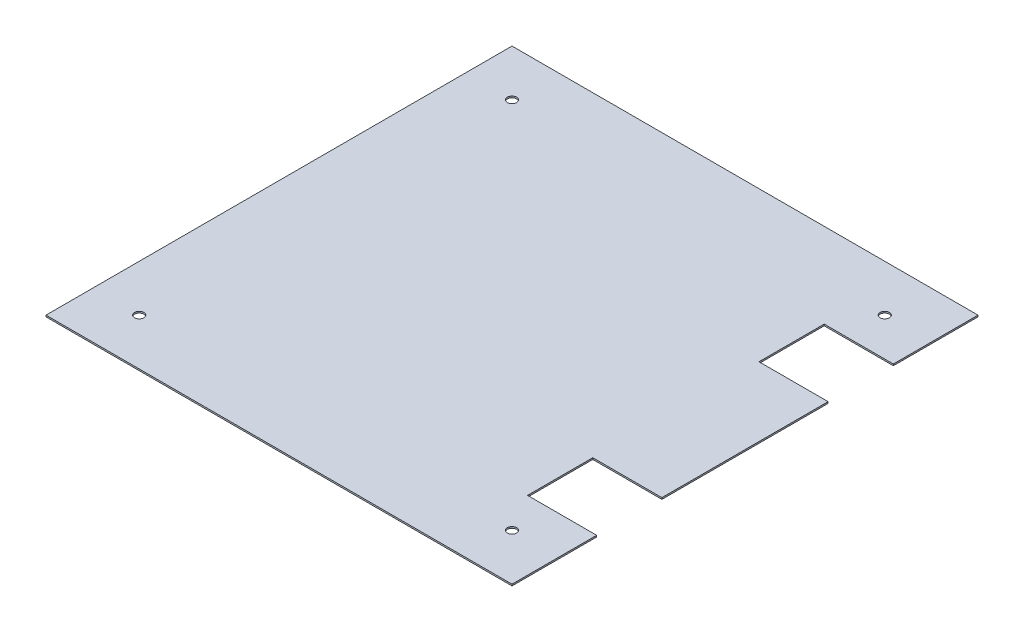
ISO-10303-21;
HEADER;
FILE_DESCRIPTION(('STEP AP214'),'2;1');
FILE_NAME('part.step','',(''),(''),'','','');
FILE_SCHEMA(('AUTOMOTIVE_DESIGN { 1 0 10303 214 1 1 1 1 }'));
ENDSEC;
DATA;
#1=APPLICATION_CONTEXT('core data for automotive mechanical design processes');
#2=APPLICATION_PROTOCOL_DEFINITION('international standard','automotive_design',2000,#1);
#3=PRODUCT_CONTEXT('',#1,'mechanical');
#4=PRODUCT('Part','Part','',(#3));
#5=PRODUCT_RELATED_PRODUCT_CATEGORY('part','',(#4));
#6=PRODUCT_DEFINITION_FORMATION('','',#4);
#7=PRODUCT_DEFINITION_CONTEXT('part definition',#1,'design');
#8=PRODUCT_DEFINITION('design','',#6,#7);
#9=PRODUCT_DEFINITION_SHAPE('','',#8);
#10=(LENGTH_UNIT() NAMED_UNIT(*) SI_UNIT(.MILLI.,.METRE.));
#11=(NAMED_UNIT(*) PLANE_ANGLE_UNIT() SI_UNIT($,.RADIAN.));
#12=(NAMED_UNIT(*) SI_UNIT($,.STERADIAN.) SOLID_ANGLE_UNIT());
#13=UNCERTAINTY_MEASURE_WITH_UNIT(LENGTH_MEASURE(1.E-05),#10,'distance_accuracy_value','');
#14=(GEOMETRIC_REPRESENTATION_CONTEXT(3) GLOBAL_UNCERTAINTY_ASSIGNED_CONTEXT((#13)) GLOBAL_UNIT_ASSIGNED_CONTEXT((#10,
#11,#12)) REPRESENTATION_CONTEXT('',''));
#15=CARTESIAN_POINT('',(0.,0.,0.));
#16=DIRECTION('',(0.,0.,1.));
#17=DIRECTION('',(1.,0.,0.));
#18=AXIS2_PLACEMENT_3D('',#15,#16,#17);
#19=CARTESIAN_POINT('',(0.,1.,0.));
#20=DIRECTION('',(0.,1.,0.));
#21=DIRECTION('',(0.,0.,1.));
#22=AXIS2_PLACEMENT_3D('',#19,#20,#21);
#23=PLANE('',#22);
#24=CARTESIAN_POINT('',(213.243141408516,1.,253.714524623906));
#25=DIRECTION('',(0.,1.,0.));
#26=DIRECTION('',(0.,0.,1.));
#27=AXIS2_PLACEMENT_3D('',#24,#25,#26);
#28=CIRCLE('',#27,2.99999999999999);
#29=CARTESIAN_POINT('',(213.243141408516,1.,256.714524623906));
#30=VERTEX_POINT('',#29);
#31=EDGE_CURVE('E189',#30,#30,#28,.T.);
#32=ORIENTED_EDGE('',*,*,#31,.F.);
#33=EDGE_LOOP('',(#32));
#34=FACE_BOUND('',#33,.T.);
#35=CARTESIAN_POINT('',(-26.7568585914842,1.,13.7145246239061));
#36=DIRECTION('',(0.,1.,0.));
#37=DIRECTION('',(0.,0.,1.));
#38=AXIS2_PLACEMENT_3D('',#35,#36,#37);
#39=CIRCLE('',#38,3.);
#40=CARTESIAN_POINT('',(-26.7568585914842,1.,16.7145246239061));
#41=VERTEX_POINT('',#40);
#42=EDGE_CURVE('E201',#41,#41,#39,.T.);
#43=ORIENTED_EDGE('',*,*,#42,.F.);
#44=EDGE_LOOP('',(#43));
#45=FACE_BOUND('',#44,.T.);
#46=CARTESIAN_POINT('',(213.243141408516,1.,13.7145246239061));
#47=DIRECTION('',(0.,1.,0.));
#48=DIRECTION('',(0.,0.,1.));
#49=AXIS2_PLACEMENT_3D('',#46,#47,#48);
#50=CIRCLE('',#49,2.99999999999999);
#51=CARTESIAN_POINT('',(213.243141408516,1.,16.7145246239061));
#52=VERTEX_POINT('',#51);
#53=EDGE_CURVE('E195',#52,#52,#50,.T.);
#54=ORIENTED_EDGE('',*,*,#53,.F.);
#55=EDGE_LOOP('',(#54));
#56=FACE_BOUND('',#55,.T.);
#57=CARTESIAN_POINT('',(-26.7568585914842,1.,253.714524623906));
#58=DIRECTION('',(0.,1.,0.));
#59=DIRECTION('',(0.,0.,1.));
#60=AXIS2_PLACEMENT_3D('',#57,#58,#59);
#61=CIRCLE('',#60,3.);
#62=CARTESIAN_POINT('',(-26.7568585914842,1.,256.714524623906));
#63=VERTEX_POINT('',#62);
#64=EDGE_CURVE('E183',#63,#63,#61,.T.);
#65=ORIENTED_EDGE('',*,*,#64,.F.);
#66=EDGE_LOOP('',(#65));
#67=FACE_BOUND('',#66,.T.);
#68=DIRECTION('',(0.,0.,-1.));
#69=VECTOR('',#68,1.);
#70=CARTESIAN_POINT('',(243.243141408516,1.,-16.2854753760939));
#71=LINE('',#70,#69);
#72=CARTESIAN_POINT('',(243.243141408516,1.,187.214524623906));
#73=VERTEX_POINT('',#72);
#74=CARTESIAN_POINT('',(243.243141408516,1.,80.2145246239061));
#75=VERTEX_POINT('',#74);
#76=EDGE_CURVE('E148',#73,#75,#71,.T.);
#77=ORIENTED_EDGE('',*,*,#76,.T.);
#78=DIRECTION('',(1.,0.,0.));
#79=VECTOR('',#78,1.);
#80=CARTESIAN_POINT('',(198.743141408516,1.,80.2145246239061));
#81=LINE('',#80,#79);
#82=CARTESIAN_POINT('',(198.743141408516,1.,80.2145246239061));
#83=VERTEX_POINT('',#82);
#84=EDGE_CURVE('E135',#83,#75,#81,.T.);
#85=ORIENTED_EDGE('',*,*,#84,.F.);
#86=DIRECTION('',(0.,0.,1.));
#87=VECTOR('',#86,1.);
#88=CARTESIAN_POINT('',(198.743141408516,1.,38.2145246239061));
#89=LINE('',#88,#87);
#90=CARTESIAN_POINT('',(198.743141408516,1.,38.2145246239061));
#91=VERTEX_POINT('',#90);
#92=EDGE_CURVE('E125',#91,#83,#89,.T.);
#93=ORIENTED_EDGE('',*,*,#92,.F.);
#94=DIRECTION('',(-1.,0.,0.));
#95=VECTOR('',#94,1.);
#96=CARTESIAN_POINT('',(198.743141408516,1.,38.2145246239061));
#97=LINE('',#96,#95);
#98=CARTESIAN_POINT('',(243.243141408516,1.,38.2145246239061));
#99=VERTEX_POINT('',#98);
#100=EDGE_CURVE('E149',#99,#91,#97,.T.);
#101=ORIENTED_EDGE('',*,*,#100,.F.);
#102=CARTESIAN_POINT('',(243.243141408516,1.,-16.2854753760939));
#103=VERTEX_POINT('',#102);
#104=EDGE_CURVE('E213',#99,#103,#71,.T.);
#105=ORIENTED_EDGE('',*,*,#104,.T.);
#106=DIRECTION('',(-1.,0.,0.));
#107=VECTOR('',#106,1.);
#108=CARTESIAN_POINT('',(-56.7568585914842,1.,-16.2854753760939));
#109=LINE('',#108,#107);
#110=CARTESIAN_POINT('',(-56.7568585914842,1.,-16.2854753760939));
#111=VERTEX_POINT('',#110);
#112=EDGE_CURVE('E217',#103,#111,#109,.T.);
#113=ORIENTED_EDGE('',*,*,#112,.T.);
#114=DIRECTION('',(0.,0.,1.));
#115=VECTOR('',#114,1.);
#116=CARTESIAN_POINT('',(-56.7568585914842,1.,-16.2854753760939));
#117=LINE('',#116,#115);
#118=CARTESIAN_POINT('',(-56.7568585914841,1.,283.714524623906));
#119=VERTEX_POINT('',#118);
#120=EDGE_CURVE('E207',#111,#119,#117,.T.);
#121=ORIENTED_EDGE('',*,*,#120,.T.);
#122=DIRECTION('',(1.,0.,0.));
#123=VECTOR('',#122,1.);
#124=CARTESIAN_POINT('',(-56.7568585914841,1.,283.714524623906));
#125=LINE('',#124,#123);
#126=CARTESIAN_POINT('',(243.243141408516,1.,283.714524623906));
#127=VERTEX_POINT('',#126);
#128=EDGE_CURVE('E210',#119,#127,#125,.T.);
#129=ORIENTED_EDGE('',*,*,#128,.T.);
#130=CARTESIAN_POINT('',(243.243141408516,1.,229.214524623906));
#131=VERTEX_POINT('',#130);
#132=EDGE_CURVE('E214',#127,#131,#71,.T.);
#133=ORIENTED_EDGE('',*,*,#132,.T.);
#134=DIRECTION('',(1.,0.,0.));
#135=VECTOR('',#134,1.);
#136=CARTESIAN_POINT('',(198.743141408516,1.,229.214524623906));
#137=LINE('',#136,#135);
#138=CARTESIAN_POINT('',(198.743141408516,1.,229.214524623906));
#139=VERTEX_POINT('',#138);
#140=EDGE_CURVE('E163',#139,#131,#137,.T.);
#141=ORIENTED_EDGE('',*,*,#140,.F.);
#142=DIRECTION('',(0.,0.,1.));
#143=VECTOR('',#142,1.);
#144=CARTESIAN_POINT('',(198.743141408516,1.,187.214524623906));
#145=LINE('',#144,#143);
#146=CARTESIAN_POINT('',(198.743141408516,1.,187.214524623906));
#147=VERTEX_POINT('',#146);
#148=EDGE_CURVE('E161',#147,#139,#145,.T.);
#149=ORIENTED_EDGE('',*,*,#148,.F.);
#150=DIRECTION('',(-1.,0.,0.));
#151=VECTOR('',#150,1.);
#152=CARTESIAN_POINT('',(198.743141408516,1.,187.214524623906));
#153=LINE('',#152,#151);
#154=EDGE_CURVE('E165',#73,#147,#153,.T.);
#155=ORIENTED_EDGE('',*,*,#154,.F.);
#156=EDGE_LOOP('',(#77,#85,#93,#101,#105,#113,#121,#129,#133,#141,#149,#155));
#157=FACE_BOUND('',#156,.T.);
#158=ADVANCED_FACE('F35',(#34,#45,#56,#67,#157),#23,.T.);
#159=CARTESIAN_POINT('',(0.,0.,0.));
#160=DIRECTION('',(0.,1.,0.));
#161=DIRECTION('',(0.,0.,1.));
#162=AXIS2_PLACEMENT_3D('',#159,#160,#161);
#163=PLANE('',#162);
#164=CARTESIAN_POINT('',(213.243141408516,0.,253.714524623906));
#165=DIRECTION('',(0.,1.,0.));
#166=DIRECTION('',(0.,0.,1.));
#167=AXIS2_PLACEMENT_3D('',#164,#165,#166);
#168=CIRCLE('',#167,2.99999999999999);
#169=CARTESIAN_POINT('',(213.243141408516,0.,256.714524623906));
#170=VERTEX_POINT('',#169);
#171=EDGE_CURVE('E186',#170,#170,#168,.T.);
#172=ORIENTED_EDGE('',*,*,#171,.T.);
#173=EDGE_LOOP('',(#172));
#174=FACE_BOUND('',#173,.T.);
#175=CARTESIAN_POINT('',(-26.7568585914842,0.,13.7145246239061));
#176=DIRECTION('',(0.,1.,0.));
#177=DIRECTION('',(0.,0.,1.));
#178=AXIS2_PLACEMENT_3D('',#175,#176,#177);
#179=CIRCLE('',#178,3.);
#180=CARTESIAN_POINT('',(-26.7568585914842,0.,16.7145246239061));
#181=VERTEX_POINT('',#180);
#182=EDGE_CURVE('E198',#181,#181,#179,.T.);
#183=ORIENTED_EDGE('',*,*,#182,.T.);
#184=EDGE_LOOP('',(#183));
#185=FACE_BOUND('',#184,.T.);
#186=CARTESIAN_POINT('',(213.243141408516,0.,13.7145246239061));
#187=DIRECTION('',(0.,1.,0.));
#188=DIRECTION('',(0.,0.,1.));
#189=AXIS2_PLACEMENT_3D('',#186,#187,#188);
#190=CIRCLE('',#189,2.99999999999999);
#191=CARTESIAN_POINT('',(213.243141408516,0.,16.7145246239061));
#192=VERTEX_POINT('',#191);
#193=EDGE_CURVE('E192',#192,#192,#190,.T.);
#194=ORIENTED_EDGE('',*,*,#193,.T.);
#195=EDGE_LOOP('',(#194));
#196=FACE_BOUND('',#195,.T.);
#197=CARTESIAN_POINT('',(-26.7568585914842,0.,253.714524623906));
#198=DIRECTION('',(0.,1.,0.));
#199=DIRECTION('',(0.,0.,1.));
#200=AXIS2_PLACEMENT_3D('',#197,#198,#199);
#201=CIRCLE('',#200,3.);
#202=CARTESIAN_POINT('',(-26.7568585914842,0.,256.714524623906));
#203=VERTEX_POINT('',#202);
#204=EDGE_CURVE('E182',#203,#203,#201,.T.);
#205=ORIENTED_EDGE('',*,*,#204,.T.);
#206=EDGE_LOOP('',(#205));
#207=FACE_BOUND('',#206,.T.);
#208=DIRECTION('',(1.,0.,0.));
#209=VECTOR('',#208,1.);
#210=CARTESIAN_POINT('',(198.743141408516,0.,80.2145246239061));
#211=LINE('',#210,#209);
#212=CARTESIAN_POINT('',(198.743141408516,0.,80.2145246239061));
#213=VERTEX_POINT('',#212);
#214=CARTESIAN_POINT('',(243.243141408516,0.,80.2145246239061));
#215=VERTEX_POINT('',#214);
#216=EDGE_CURVE('E141',#213,#215,#211,.T.);
#217=ORIENTED_EDGE('',*,*,#216,.T.);
#218=DIRECTION('',(0.,0.,-1.));
#219=VECTOR('',#218,1.);
#220=CARTESIAN_POINT('',(243.243141408516,0.,-16.2854753760939));
#221=LINE('',#220,#219);
#222=CARTESIAN_POINT('',(243.243141408516,0.,187.214524623906));
#223=VERTEX_POINT('',#222);
#224=EDGE_CURVE('E228',#223,#215,#221,.T.);
#225=ORIENTED_EDGE('',*,*,#224,.F.);
#226=DIRECTION('',(-1.,0.,0.));
#227=VECTOR('',#226,1.);
#228=CARTESIAN_POINT('',(198.743141408516,0.,187.214524623906));
#229=LINE('',#228,#227);
#230=CARTESIAN_POINT('',(198.743141408516,0.,187.214524623906));
#231=VERTEX_POINT('',#230);
#232=EDGE_CURVE('E58',#223,#231,#229,.T.);
#233=ORIENTED_EDGE('',*,*,#232,.T.);
#234=DIRECTION('',(0.,0.,1.));
#235=VECTOR('',#234,1.);
#236=CARTESIAN_POINT('',(198.743141408516,0.,187.214524623906));
#237=LINE('',#236,#235);
#238=CARTESIAN_POINT('',(198.743141408516,0.,229.214524623906));
#239=VERTEX_POINT('',#238);
#240=EDGE_CURVE('E142',#231,#239,#237,.T.);
#241=ORIENTED_EDGE('',*,*,#240,.T.);
#242=DIRECTION('',(1.,0.,0.));
#243=VECTOR('',#242,1.);
#244=CARTESIAN_POINT('',(198.743141408516,0.,229.214524623906));
#245=LINE('',#244,#243);
#246=CARTESIAN_POINT('',(243.243141408516,0.,229.214524623906));
#247=VERTEX_POINT('',#246);
#248=EDGE_CURVE('E170',#239,#247,#245,.T.);
#249=ORIENTED_EDGE('',*,*,#248,.T.);
#250=CARTESIAN_POINT('',(243.243141408516,0.,283.714524623906));
#251=VERTEX_POINT('',#250);
#252=EDGE_CURVE('E225',#251,#247,#221,.T.);
#253=ORIENTED_EDGE('',*,*,#252,.F.);
#254=DIRECTION('',(1.,0.,0.));
#255=VECTOR('',#254,1.);
#256=CARTESIAN_POINT('',(-56.7568585914841,0.,283.714524623906));
#257=LINE('',#256,#255);
#258=CARTESIAN_POINT('',(-56.7568585914841,0.,283.714524623906));
#259=VERTEX_POINT('',#258);
#260=EDGE_CURVE('E222',#259,#251,#257,.T.);
#261=ORIENTED_EDGE('',*,*,#260,.F.);
#262=DIRECTION('',(0.,0.,1.));
#263=VECTOR('',#262,1.);
#264=CARTESIAN_POINT('',(-56.7568585914842,0.,-16.2854753760939));
#265=LINE('',#264,#263);
#266=CARTESIAN_POINT('',(-56.7568585914842,0.,-16.2854753760939));
#267=VERTEX_POINT('',#266);
#268=EDGE_CURVE('E204',#267,#259,#265,.T.);
#269=ORIENTED_EDGE('',*,*,#268,.F.);
#270=DIRECTION('',(-1.,0.,0.));
#271=VECTOR('',#270,1.);
#272=CARTESIAN_POINT('',(-56.7568585914842,0.,-16.2854753760939));
#273=LINE('',#272,#271);
#274=CARTESIAN_POINT('',(243.243141408516,0.,-16.2854753760939));
#275=VERTEX_POINT('',#274);
#276=EDGE_CURVE('E211',#275,#267,#273,.T.);
#277=ORIENTED_EDGE('',*,*,#276,.F.);
#278=CARTESIAN_POINT('',(243.243141408516,0.,38.2145246239061));
#279=VERTEX_POINT('',#278);
#280=EDGE_CURVE('E224',#279,#275,#221,.T.);
#281=ORIENTED_EDGE('',*,*,#280,.F.);
#282=DIRECTION('',(-1.,0.,0.));
#283=VECTOR('',#282,1.);
#284=CARTESIAN_POINT('',(198.743141408516,0.,38.2145246239061));
#285=LINE('',#284,#283);
#286=CARTESIAN_POINT('',(198.743141408516,0.,38.2145246239061));
#287=VERTEX_POINT('',#286);
#288=EDGE_CURVE('E50',#279,#287,#285,.T.);
#289=ORIENTED_EDGE('',*,*,#288,.T.);
#290=DIRECTION('',(0.,0.,1.));
#291=VECTOR('',#290,1.);
#292=CARTESIAN_POINT('',(198.743141408516,0.,38.2145246239061));
#293=LINE('',#292,#291);
#294=EDGE_CURVE('E153',#287,#213,#293,.T.);
#295=ORIENTED_EDGE('',*,*,#294,.T.);
#296=EDGE_LOOP('',(#217,#225,#233,#241,#249,#253,#261,#269,#277,#281,#289,#295));
#297=FACE_BOUND('',#296,.T.);
#298=ADVANCED_FACE('F243',(#174,#185,#196,#207,#297),#163,.F.);
#299=CARTESIAN_POINT('',(243.243141408516,1.,-16.2854753760939));
#300=DIRECTION('',(-1.,0.,0.));
#301=DIRECTION('',(0.,0.,1.));
#302=AXIS2_PLACEMENT_3D('',#299,#300,#301);
#303=PLANE('',#302);
#304=DIRECTION('',(0.,-1.,0.));
#305=VECTOR('',#304,1.);
#306=CARTESIAN_POINT('',(243.243141408516,1.,80.2145246239061));
#307=LINE('',#306,#305);
#308=EDGE_CURVE('E143',#75,#215,#307,.T.);
#309=ORIENTED_EDGE('',*,*,#308,.F.);
#310=ORIENTED_EDGE('',*,*,#76,.F.);
#311=DIRECTION('',(0.,-1.,0.));
#312=VECTOR('',#311,1.);
#313=CARTESIAN_POINT('',(243.243141408516,1.,187.214524623906));
#314=LINE('',#313,#312);
#315=EDGE_CURVE('E175',#73,#223,#314,.T.);
#316=ORIENTED_EDGE('',*,*,#315,.T.);
#317=ORIENTED_EDGE('',*,*,#224,.T.);
#318=EDGE_LOOP('',(#309,#310,#316,#317));
#319=FACE_BOUND('',#318,.T.);
#320=ADVANCED_FACE('F271',(#319),#303,.F.);
#321=DIRECTION('',(0.,-1.,0.));
#322=VECTOR('',#321,1.);
#323=CARTESIAN_POINT('',(243.243141408516,1.,38.2145246239061));
#324=LINE('',#323,#322);
#325=EDGE_CURVE('E158',#99,#279,#324,.T.);
#326=ORIENTED_EDGE('',*,*,#325,.T.);
#327=ORIENTED_EDGE('',*,*,#280,.T.);
#328=DIRECTION('',(0.,-1.,0.));
#329=VECTOR('',#328,1.);
#330=CARTESIAN_POINT('',(243.243141408516,1.,-16.2854753760939));
#331=LINE('',#330,#329);
#332=EDGE_CURVE('E232',#103,#275,#331,.T.);
#333=ORIENTED_EDGE('',*,*,#332,.F.);
#334=ORIENTED_EDGE('',*,*,#104,.F.);
#335=EDGE_LOOP('',(#326,#327,#333,#334));
#336=FACE_BOUND('',#335,.T.);
#337=ADVANCED_FACE('F267',(#336),#303,.F.);
#338=DIRECTION('',(0.,-1.,0.));
#339=VECTOR('',#338,1.);
#340=CARTESIAN_POINT('',(243.243141408516,1.,229.214524623906));
#341=LINE('',#340,#339);
#342=EDGE_CURVE('E177',#131,#247,#341,.T.);
#343=ORIENTED_EDGE('',*,*,#342,.F.);
#344=ORIENTED_EDGE('',*,*,#132,.F.);
#345=DIRECTION('',(0.,-1.,0.));
#346=VECTOR('',#345,1.);
#347=CARTESIAN_POINT('',(243.243141408516,1.,283.714524623906));
#348=LINE('',#347,#346);
#349=EDGE_CURVE('E43',#127,#251,#348,.T.);
#350=ORIENTED_EDGE('',*,*,#349,.T.);
#351=ORIENTED_EDGE('',*,*,#252,.T.);
#352=EDGE_LOOP('',(#343,#344,#350,#351));
#353=FACE_BOUND('',#352,.T.);
#354=ADVANCED_FACE('F240',(#353),#303,.F.);
#355=CARTESIAN_POINT('',(-56.7568585914842,1.,-16.2854753760939));
#356=DIRECTION('',(1.,0.,0.));
#357=DIRECTION('',(0.,0.,-1.));
#358=AXIS2_PLACEMENT_3D('',#355,#356,#357);
#359=PLANE('',#358);
#360=ORIENTED_EDGE('',*,*,#268,.T.);
#361=DIRECTION('',(0.,-1.,0.));
#362=VECTOR('',#361,1.);
#363=CARTESIAN_POINT('',(-56.7568585914841,1.,283.714524623906));
#364=LINE('',#363,#362);
#365=EDGE_CURVE('E11',#119,#259,#364,.T.);
#366=ORIENTED_EDGE('',*,*,#365,.F.);
#367=ORIENTED_EDGE('',*,*,#120,.F.);
#368=DIRECTION('',(0.,-1.,0.));
#369=VECTOR('',#368,1.);
#370=CARTESIAN_POINT('',(-56.7568585914842,1.,-16.2854753760939));
#371=LINE('',#370,#369);
#372=EDGE_CURVE('E219',#111,#267,#371,.T.);
#373=ORIENTED_EDGE('',*,*,#372,.T.);
#374=EDGE_LOOP('',(#360,#366,#367,#373));
#375=FACE_BOUND('',#374,.T.);
#376=ADVANCED_FACE('F37',(#375),#359,.F.);
#377=CARTESIAN_POINT('',(-56.7568585914841,1.,283.714524623906));
#378=DIRECTION('',(0.,0.,-1.));
#379=DIRECTION('',(-1.,0.,0.));
#380=AXIS2_PLACEMENT_3D('',#377,#378,#379);
#381=PLANE('',#380);
#382=ORIENTED_EDGE('',*,*,#260,.T.);
#383=ORIENTED_EDGE('',*,*,#349,.F.);
#384=ORIENTED_EDGE('',*,*,#128,.F.);
#385=ORIENTED_EDGE('',*,*,#365,.T.);
#386=EDGE_LOOP('',(#382,#383,#384,#385));
#387=FACE_BOUND('',#386,.T.);
#388=ADVANCED_FACE('F256',(#387),#381,.F.);
#389=CARTESIAN_POINT('',(-56.7568585914842,1.,-16.2854753760939));
#390=DIRECTION('',(0.,0.,1.));
#391=DIRECTION('',(1.,0.,0.));
#392=AXIS2_PLACEMENT_3D('',#389,#390,#391);
#393=PLANE('',#392);
#394=ORIENTED_EDGE('',*,*,#276,.T.);
#395=ORIENTED_EDGE('',*,*,#372,.F.);
#396=ORIENTED_EDGE('',*,*,#112,.F.);
#397=ORIENTED_EDGE('',*,*,#332,.T.);
#398=EDGE_LOOP('',(#394,#395,#396,#397));
#399=FACE_BOUND('',#398,.T.);
#400=ADVANCED_FACE('F262',(#399),#393,.F.);
#401=CARTESIAN_POINT('',(-26.7568585914842,1.,13.7145246239061));
#402=DIRECTION('',(0.,-1.,0.));
#403=DIRECTION('',(0.,0.,-1.));
#404=AXIS2_PLACEMENT_3D('',#401,#402,#403);
#405=CYLINDRICAL_SURFACE('',#404,3.);
#406=ORIENTED_EDGE('',*,*,#42,.T.);
#407=EDGE_LOOP('',(#406));
#408=FACE_BOUND('',#407,.T.);
#409=ORIENTED_EDGE('',*,*,#182,.F.);
#410=EDGE_LOOP('',(#409));
#411=FACE_BOUND('',#410,.T.);
#412=ADVANCED_FACE('F293',(#408,#411),#405,.F.);
#413=CARTESIAN_POINT('',(213.243141408516,1.,13.7145246239061));
#414=DIRECTION('',(0.,-1.,0.));
#415=DIRECTION('',(0.,0.,-1.));
#416=AXIS2_PLACEMENT_3D('',#413,#414,#415);
#417=CYLINDRICAL_SURFACE('',#416,2.99999999999999);
#418=ORIENTED_EDGE('',*,*,#53,.T.);
#419=EDGE_LOOP('',(#418));
#420=FACE_BOUND('',#419,.T.);
#421=ORIENTED_EDGE('',*,*,#193,.F.);
#422=EDGE_LOOP('',(#421));
#423=FACE_BOUND('',#422,.T.);
#424=ADVANCED_FACE('F325',(#420,#423),#417,.F.);
#425=CARTESIAN_POINT('',(213.243141408516,1.,253.714524623906));
#426=DIRECTION('',(0.,-1.,0.));
#427=DIRECTION('',(0.,0.,-1.));
#428=AXIS2_PLACEMENT_3D('',#425,#426,#427);
#429=CYLINDRICAL_SURFACE('',#428,2.99999999999999);
#430=ORIENTED_EDGE('',*,*,#31,.T.);
#431=EDGE_LOOP('',(#430));
#432=FACE_BOUND('',#431,.T.);
#433=ORIENTED_EDGE('',*,*,#171,.F.);
#434=EDGE_LOOP('',(#433));
#435=FACE_BOUND('',#434,.T.);
#436=ADVANCED_FACE('F334',(#432,#435),#429,.F.);
#437=CARTESIAN_POINT('',(-26.7568585914842,1.,253.714524623906));
#438=DIRECTION('',(0.,-1.,0.));
#439=DIRECTION('',(0.,0.,-1.));
#440=AXIS2_PLACEMENT_3D('',#437,#438,#439);
#441=CYLINDRICAL_SURFACE('',#440,3.);
#442=ORIENTED_EDGE('',*,*,#64,.T.);
#443=EDGE_LOOP('',(#442));
#444=FACE_BOUND('',#443,.T.);
#445=ORIENTED_EDGE('',*,*,#204,.F.);
#446=EDGE_LOOP('',(#445));
#447=FACE_BOUND('',#446,.T.);
#448=ADVANCED_FACE('F342',(#444,#447),#441,.F.);
#449=CARTESIAN_POINT('',(198.743141408516,1.,187.214524623906));
#450=DIRECTION('',(1.,0.,0.));
#451=DIRECTION('',(0.,0.,-1.));
#452=AXIS2_PLACEMENT_3D('',#449,#450,#451);
#453=PLANE('',#452);
#454=ORIENTED_EDGE('',*,*,#240,.F.);
#455=DIRECTION('',(0.,-1.,0.));
#456=VECTOR('',#455,1.);
#457=CARTESIAN_POINT('',(198.743141408516,1.,187.214524623906));
#458=LINE('',#457,#456);
#459=EDGE_CURVE('E167',#147,#231,#458,.T.);
#460=ORIENTED_EDGE('',*,*,#459,.F.);
#461=ORIENTED_EDGE('',*,*,#148,.T.);
#462=DIRECTION('',(0.,-1.,0.));
#463=VECTOR('',#462,1.);
#464=CARTESIAN_POINT('',(198.743141408516,1.,229.214524623906));
#465=LINE('',#464,#463);
#466=EDGE_CURVE('E179',#139,#239,#465,.T.);
#467=ORIENTED_EDGE('',*,*,#466,.T.);
#468=EDGE_LOOP('',(#454,#460,#461,#467));
#469=FACE_BOUND('',#468,.T.);
#470=ADVANCED_FACE('F251',(#469),#453,.T.);
#471=CARTESIAN_POINT('',(198.743141408516,1.,229.214524623906));
#472=DIRECTION('',(0.,0.,-1.));
#473=DIRECTION('',(-1.,0.,0.));
#474=AXIS2_PLACEMENT_3D('',#471,#472,#473);
#475=PLANE('',#474);
#476=ORIENTED_EDGE('',*,*,#248,.F.);
#477=ORIENTED_EDGE('',*,*,#466,.F.);
#478=ORIENTED_EDGE('',*,*,#140,.T.);
#479=ORIENTED_EDGE('',*,*,#342,.T.);
#480=EDGE_LOOP('',(#476,#477,#478,#479));
#481=FACE_BOUND('',#480,.T.);
#482=ADVANCED_FACE('F248',(#481),#475,.T.);
#483=CARTESIAN_POINT('',(198.743141408516,1.,187.214524623906));
#484=DIRECTION('',(0.,0.,1.));
#485=DIRECTION('',(1.,0.,0.));
#486=AXIS2_PLACEMENT_3D('',#483,#484,#485);
#487=PLANE('',#486);
#488=ORIENTED_EDGE('',*,*,#232,.F.);
#489=ORIENTED_EDGE('',*,*,#315,.F.);
#490=ORIENTED_EDGE('',*,*,#154,.T.);
#491=ORIENTED_EDGE('',*,*,#459,.T.);
#492=EDGE_LOOP('',(#488,#489,#490,#491));
#493=FACE_BOUND('',#492,.T.);
#494=ADVANCED_FACE('F272',(#493),#487,.T.);
#495=CARTESIAN_POINT('',(198.743141408516,1.,38.2145246239061));
#496=DIRECTION('',(1.,0.,0.));
#497=DIRECTION('',(0.,0.,-1.));
#498=AXIS2_PLACEMENT_3D('',#495,#496,#497);
#499=PLANE('',#498);
#500=ORIENTED_EDGE('',*,*,#294,.F.);
#501=DIRECTION('',(0.,-1.,0.));
#502=VECTOR('',#501,1.);
#503=CARTESIAN_POINT('',(198.743141408516,1.,38.2145246239061));
#504=LINE('',#503,#502);
#505=EDGE_CURVE('E131',#91,#287,#504,.T.);
#506=ORIENTED_EDGE('',*,*,#505,.F.);
#507=ORIENTED_EDGE('',*,*,#92,.T.);
#508=DIRECTION('',(0.,-1.,0.));
#509=VECTOR('',#508,1.);
#510=CARTESIAN_POINT('',(198.743141408516,1.,80.2145246239061));
#511=LINE('',#510,#509);
#512=EDGE_CURVE('E129',#83,#213,#511,.T.);
#513=ORIENTED_EDGE('',*,*,#512,.T.);
#514=EDGE_LOOP('',(#500,#506,#507,#513));
#515=FACE_BOUND('',#514,.T.);
#516=ADVANCED_FACE('F128',(#515),#499,.T.);
#517=CARTESIAN_POINT('',(198.743141408516,1.,80.2145246239061));
#518=DIRECTION('',(0.,0.,-1.));
#519=DIRECTION('',(-1.,0.,0.));
#520=AXIS2_PLACEMENT_3D('',#517,#518,#519);
#521=PLANE('',#520);
#522=ORIENTED_EDGE('',*,*,#216,.F.);
#523=ORIENTED_EDGE('',*,*,#512,.F.);
#524=ORIENTED_EDGE('',*,*,#84,.T.);
#525=ORIENTED_EDGE('',*,*,#308,.T.);
#526=EDGE_LOOP('',(#522,#523,#524,#525));
#527=FACE_BOUND('',#526,.T.);
#528=ADVANCED_FACE('F138',(#527),#521,.T.);
#529=CARTESIAN_POINT('',(198.743141408516,1.,38.2145246239061));
#530=DIRECTION('',(0.,0.,1.));
#531=DIRECTION('',(1.,0.,0.));
#532=AXIS2_PLACEMENT_3D('',#529,#530,#531);
#533=PLANE('',#532);
#534=ORIENTED_EDGE('',*,*,#288,.F.);
#535=ORIENTED_EDGE('',*,*,#325,.F.);
#536=ORIENTED_EDGE('',*,*,#100,.T.);
#537=ORIENTED_EDGE('',*,*,#505,.T.);
#538=EDGE_LOOP('',(#534,#535,#536,#537));
#539=FACE_BOUND('',#538,.T.);
#540=ADVANCED_FACE('F384',(#539),#533,.T.);
#541=CLOSED_SHELL('',(#158,#298,#320,#337,#354,#376,#388,#400,#412,#424,#436,#448,#470,#482,
#494,#516,#528,#540));
#542=MANIFOLD_SOLID_BREP('B2',#541);
#543=ADVANCED_BREP_SHAPE_REPRESENTATION('',(#18,#542),#14);
#544=SHAPE_DEFINITION_REPRESENTATION(#9,#543);
ENDSEC;
END-ISO-10303-21;
